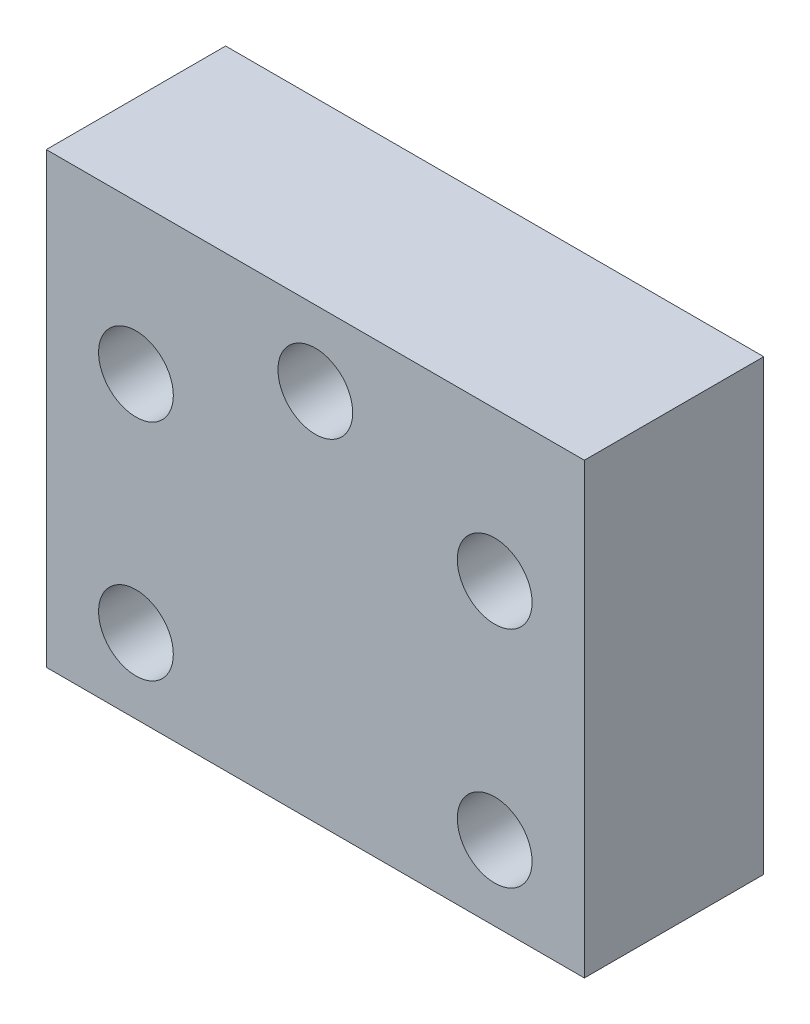
ISO-10303-21;
HEADER;
FILE_DESCRIPTION(('STEP AP214'),'2;1');
FILE_NAME('part.step','',(''),(''),'','','');
FILE_SCHEMA(('AUTOMOTIVE_DESIGN { 1 0 10303 214 1 1 1 1 }'));
ENDSEC;
DATA;
#1=APPLICATION_CONTEXT('core data for automotive mechanical design processes');
#2=APPLICATION_PROTOCOL_DEFINITION('international standard','automotive_design',2000,#1);
#3=PRODUCT_CONTEXT('',#1,'mechanical');
#4=PRODUCT('Part','Part','',(#3));
#5=PRODUCT_RELATED_PRODUCT_CATEGORY('part','',(#4));
#6=PRODUCT_DEFINITION_FORMATION('','',#4);
#7=PRODUCT_DEFINITION_CONTEXT('part definition',#1,'design');
#8=PRODUCT_DEFINITION('design','',#6,#7);
#9=PRODUCT_DEFINITION_SHAPE('','',#8);
#10=(LENGTH_UNIT() NAMED_UNIT(*) SI_UNIT(.MILLI.,.METRE.));
#11=(NAMED_UNIT(*) PLANE_ANGLE_UNIT() SI_UNIT($,.RADIAN.));
#12=(NAMED_UNIT(*) SI_UNIT($,.STERADIAN.) SOLID_ANGLE_UNIT());
#13=UNCERTAINTY_MEASURE_WITH_UNIT(LENGTH_MEASURE(1.E-05),#10,'distance_accuracy_value','');
#14=(GEOMETRIC_REPRESENTATION_CONTEXT(3) GLOBAL_UNCERTAINTY_ASSIGNED_CONTEXT((#13)) GLOBAL_UNIT_ASSIGNED_CONTEXT((#10,
#11,#12)) REPRESENTATION_CONTEXT('',''));
#15=CARTESIAN_POINT('',(0.,0.,0.));
#16=DIRECTION('',(0.,0.,1.));
#17=DIRECTION('',(1.,0.,0.));
#18=AXIS2_PLACEMENT_3D('',#15,#16,#17);
#19=CARTESIAN_POINT('',(-18.,-15.,12.));
#20=DIRECTION('',(1.,0.,0.));
#21=DIRECTION('',(0.,0.,-1.));
#22=AXIS2_PLACEMENT_3D('',#19,#20,#21);
#23=PLANE('',#22);
#24=DIRECTION('',(0.,-1.,0.));
#25=VECTOR('',#24,1.);
#26=CARTESIAN_POINT('',(-18.,-15.,0.));
#27=LINE('',#26,#25);
#28=CARTESIAN_POINT('',(-18.,15.,0.));
#29=VERTEX_POINT('',#28);
#30=CARTESIAN_POINT('',(-18.,-15.,0.));
#31=VERTEX_POINT('',#30);
#32=EDGE_CURVE('E96',#29,#31,#27,.T.);
#33=ORIENTED_EDGE('',*,*,#32,.T.);
#34=DIRECTION('',(0.,0.,-1.));
#35=VECTOR('',#34,1.);
#36=CARTESIAN_POINT('',(-18.,-15.,12.));
#37=LINE('',#36,#35);
#38=CARTESIAN_POINT('',(-18.,-15.,12.));
#39=VERTEX_POINT('',#38);
#40=EDGE_CURVE('E11',#39,#31,#37,.T.);
#41=ORIENTED_EDGE('',*,*,#40,.F.);
#42=DIRECTION('',(0.,-1.,0.));
#43=VECTOR('',#42,1.);
#44=CARTESIAN_POINT('',(-18.,-15.,12.));
#45=LINE('',#44,#43);
#46=CARTESIAN_POINT('',(-18.,15.,12.));
#47=VERTEX_POINT('',#46);
#48=EDGE_CURVE('E84',#47,#39,#45,.T.);
#49=ORIENTED_EDGE('',*,*,#48,.F.);
#50=DIRECTION('',(0.,0.,-1.));
#51=VECTOR('',#50,1.);
#52=CARTESIAN_POINT('',(-18.,15.,12.));
#53=LINE('',#52,#51);
#54=EDGE_CURVE('E92',#47,#29,#53,.T.);
#55=ORIENTED_EDGE('',*,*,#54,.T.);
#56=EDGE_LOOP('',(#33,#41,#49,#55));
#57=FACE_BOUND('',#56,.T.);
#58=ADVANCED_FACE('F33',(#57),#23,.F.);
#59=CARTESIAN_POINT('',(18.,-15.,12.));
#60=DIRECTION('',(0.,1.,0.));
#61=DIRECTION('',(-1.,0.,0.));
#62=AXIS2_PLACEMENT_3D('',#59,#60,#61);
#63=PLANE('',#62);
#64=DIRECTION('',(1.,0.,0.));
#65=VECTOR('',#64,1.);
#66=CARTESIAN_POINT('',(18.,-15.,0.));
#67=LINE('',#66,#65);
#68=CARTESIAN_POINT('',(18.,-15.,0.));
#69=VERTEX_POINT('',#68);
#70=EDGE_CURVE('E88',#31,#69,#67,.T.);
#71=ORIENTED_EDGE('',*,*,#70,.T.);
#72=DIRECTION('',(0.,0.,-1.));
#73=VECTOR('',#72,1.);
#74=CARTESIAN_POINT('',(18.,-15.,12.));
#75=LINE('',#74,#73);
#76=CARTESIAN_POINT('',(18.,-15.,12.));
#77=VERTEX_POINT('',#76);
#78=EDGE_CURVE('E41',#77,#69,#75,.T.);
#79=ORIENTED_EDGE('',*,*,#78,.F.);
#80=DIRECTION('',(1.,0.,0.));
#81=VECTOR('',#80,1.);
#82=CARTESIAN_POINT('',(18.,-15.,12.));
#83=LINE('',#82,#81);
#84=EDGE_CURVE('E79',#39,#77,#83,.T.);
#85=ORIENTED_EDGE('',*,*,#84,.F.);
#86=ORIENTED_EDGE('',*,*,#40,.T.);
#87=EDGE_LOOP('',(#71,#79,#85,#86));
#88=FACE_BOUND('',#87,.T.);
#89=ADVANCED_FACE('F87',(#88),#63,.F.);
#90=CARTESIAN_POINT('',(18.,-15.,12.));
#91=DIRECTION('',(-1.,0.,0.));
#92=DIRECTION('',(0.,0.,1.));
#93=AXIS2_PLACEMENT_3D('',#90,#91,#92);
#94=PLANE('',#93);
#95=DIRECTION('',(0.,1.,0.));
#96=VECTOR('',#95,1.);
#97=CARTESIAN_POINT('',(18.,-15.,0.));
#98=LINE('',#97,#96);
#99=CARTESIAN_POINT('',(18.,15.,0.));
#100=VERTEX_POINT('',#99);
#101=EDGE_CURVE('E66',#69,#100,#98,.T.);
#102=ORIENTED_EDGE('',*,*,#101,.T.);
#103=DIRECTION('',(0.,0.,-1.));
#104=VECTOR('',#103,1.);
#105=CARTESIAN_POINT('',(18.,15.,12.));
#106=LINE('',#105,#104);
#107=CARTESIAN_POINT('',(18.,15.,12.));
#108=VERTEX_POINT('',#107);
#109=EDGE_CURVE('E89',#108,#100,#106,.T.);
#110=ORIENTED_EDGE('',*,*,#109,.F.);
#111=DIRECTION('',(0.,1.,0.));
#112=VECTOR('',#111,1.);
#113=CARTESIAN_POINT('',(18.,-15.,12.));
#114=LINE('',#113,#112);
#115=EDGE_CURVE('E82',#77,#108,#114,.T.);
#116=ORIENTED_EDGE('',*,*,#115,.F.);
#117=ORIENTED_EDGE('',*,*,#78,.T.);
#118=EDGE_LOOP('',(#102,#110,#116,#117));
#119=FACE_BOUND('',#118,.T.);
#120=ADVANCED_FACE('F90',(#119),#94,.F.);
#121=CARTESIAN_POINT('',(18.,15.,12.));
#122=DIRECTION('',(0.,-1.,0.));
#123=DIRECTION('',(1.,0.,0.));
#124=AXIS2_PLACEMENT_3D('',#121,#122,#123);
#125=PLANE('',#124);
#126=DIRECTION('',(-1.,0.,0.));
#127=VECTOR('',#126,1.);
#128=CARTESIAN_POINT('',(18.,15.,0.));
#129=LINE('',#128,#127);
#130=EDGE_CURVE('E72',#100,#29,#129,.T.);
#131=ORIENTED_EDGE('',*,*,#130,.T.);
#132=ORIENTED_EDGE('',*,*,#54,.F.);
#133=DIRECTION('',(-1.,0.,0.));
#134=VECTOR('',#133,1.);
#135=CARTESIAN_POINT('',(18.,15.,12.));
#136=LINE('',#135,#134);
#137=EDGE_CURVE('E49',#108,#47,#136,.T.);
#138=ORIENTED_EDGE('',*,*,#137,.F.);
#139=ORIENTED_EDGE('',*,*,#109,.T.);
#140=EDGE_LOOP('',(#131,#132,#138,#139));
#141=FACE_BOUND('',#140,.T.);
#142=ADVANCED_FACE('F104',(#141),#125,.F.);
#143=CARTESIAN_POINT('',(0.,0.,12.));
#144=DIRECTION('',(0.,0.,1.));
#145=DIRECTION('',(1.,0.,0.));
#146=AXIS2_PLACEMENT_3D('',#143,#144,#145);
#147=PLANE('',#146);
#148=CARTESIAN_POINT('',(0.,10.,12.));
#149=DIRECTION('',(0.,0.,1.));
#150=DIRECTION('',(1.,0.,0.));
#151=AXIS2_PLACEMENT_3D('',#148,#149,#150);
#152=CIRCLE('',#151,2.5);
#153=CARTESIAN_POINT('',(2.5,10.,12.));
#154=VERTEX_POINT('',#153);
#155=EDGE_CURVE('E134',#154,#154,#152,.T.);
#156=ORIENTED_EDGE('',*,*,#155,.F.);
#157=EDGE_LOOP('',(#156));
#158=FACE_BOUND('',#157,.T.);
#159=CARTESIAN_POINT('',(-12.,-10.,12.));
#160=DIRECTION('',(0.,0.,1.));
#161=DIRECTION('',(1.,0.,0.));
#162=AXIS2_PLACEMENT_3D('',#159,#160,#161);
#163=CIRCLE('',#162,2.5);
#164=CARTESIAN_POINT('',(-9.5,-10.,12.));
#165=VERTEX_POINT('',#164);
#166=EDGE_CURVE('E116',#165,#165,#163,.T.);
#167=ORIENTED_EDGE('',*,*,#166,.F.);
#168=EDGE_LOOP('',(#167));
#169=FACE_BOUND('',#168,.T.);
#170=CARTESIAN_POINT('',(12.,-10.,12.));
#171=DIRECTION('',(0.,0.,1.));
#172=DIRECTION('',(1.,0.,0.));
#173=AXIS2_PLACEMENT_3D('',#170,#171,#172);
#174=CIRCLE('',#173,2.5);
#175=CARTESIAN_POINT('',(14.5,-10.,12.));
#176=VERTEX_POINT('',#175);
#177=EDGE_CURVE('E123',#176,#176,#174,.T.);
#178=ORIENTED_EDGE('',*,*,#177,.F.);
#179=EDGE_LOOP('',(#178));
#180=FACE_BOUND('',#179,.T.);
#181=CARTESIAN_POINT('',(12.,5.,12.));
#182=DIRECTION('',(0.,0.,1.));
#183=DIRECTION('',(1.,0.,0.));
#184=AXIS2_PLACEMENT_3D('',#181,#182,#183);
#185=CIRCLE('',#184,2.5);
#186=CARTESIAN_POINT('',(14.5,5.,12.));
#187=VERTEX_POINT('',#186);
#188=EDGE_CURVE('E129',#187,#187,#185,.T.);
#189=ORIENTED_EDGE('',*,*,#188,.F.);
#190=EDGE_LOOP('',(#189));
#191=FACE_BOUND('',#190,.T.);
#192=CARTESIAN_POINT('',(-12.,5.,12.));
#193=DIRECTION('',(0.,0.,1.));
#194=DIRECTION('',(1.,0.,0.));
#195=AXIS2_PLACEMENT_3D('',#192,#193,#194);
#196=CIRCLE('',#195,2.5);
#197=CARTESIAN_POINT('',(-9.5,5.,12.));
#198=VERTEX_POINT('',#197);
#199=EDGE_CURVE('E110',#198,#198,#196,.T.);
#200=ORIENTED_EDGE('',*,*,#199,.F.);
#201=EDGE_LOOP('',(#200));
#202=FACE_BOUND('',#201,.T.);
#203=ORIENTED_EDGE('',*,*,#48,.T.);
#204=ORIENTED_EDGE('',*,*,#84,.T.);
#205=ORIENTED_EDGE('',*,*,#115,.T.);
#206=ORIENTED_EDGE('',*,*,#137,.T.);
#207=EDGE_LOOP('',(#203,#204,#205,#206));
#208=FACE_BOUND('',#207,.T.);
#209=ADVANCED_FACE('F80',(#158,#169,#180,#191,#202,#208),#147,.T.);
#210=CARTESIAN_POINT('',(0.,0.,0.));
#211=DIRECTION('',(0.,0.,1.));
#212=DIRECTION('',(1.,0.,0.));
#213=AXIS2_PLACEMENT_3D('',#210,#211,#212);
#214=PLANE('',#213);
#215=CARTESIAN_POINT('',(0.,10.,0.));
#216=DIRECTION('',(0.,0.,1.));
#217=DIRECTION('',(1.,0.,0.));
#218=AXIS2_PLACEMENT_3D('',#215,#216,#217);
#219=CIRCLE('',#218,2.5);
#220=CARTESIAN_POINT('',(2.5,10.,0.));
#221=VERTEX_POINT('',#220);
#222=EDGE_CURVE('E120',#221,#221,#219,.T.);
#223=ORIENTED_EDGE('',*,*,#222,.T.);
#224=EDGE_LOOP('',(#223));
#225=FACE_BOUND('',#224,.T.);
#226=CARTESIAN_POINT('',(-12.,-10.,0.));
#227=DIRECTION('',(0.,0.,1.));
#228=DIRECTION('',(1.,0.,0.));
#229=AXIS2_PLACEMENT_3D('',#226,#227,#228);
#230=CIRCLE('',#229,2.5);
#231=CARTESIAN_POINT('',(-9.5,-10.,0.));
#232=VERTEX_POINT('',#231);
#233=EDGE_CURVE('E119',#232,#232,#230,.T.);
#234=ORIENTED_EDGE('',*,*,#233,.T.);
#235=EDGE_LOOP('',(#234));
#236=FACE_BOUND('',#235,.T.);
#237=CARTESIAN_POINT('',(12.,-10.,0.));
#238=DIRECTION('',(0.,0.,1.));
#239=DIRECTION('',(1.,0.,0.));
#240=AXIS2_PLACEMENT_3D('',#237,#238,#239);
#241=CIRCLE('',#240,2.5);
#242=CARTESIAN_POINT('',(14.5,-10.,0.));
#243=VERTEX_POINT('',#242);
#244=EDGE_CURVE('E126',#243,#243,#241,.T.);
#245=ORIENTED_EDGE('',*,*,#244,.T.);
#246=EDGE_LOOP('',(#245));
#247=FACE_BOUND('',#246,.T.);
#248=CARTESIAN_POINT('',(12.,5.,0.));
#249=DIRECTION('',(0.,0.,1.));
#250=DIRECTION('',(1.,0.,0.));
#251=AXIS2_PLACEMENT_3D('',#248,#249,#250);
#252=CIRCLE('',#251,2.5);
#253=CARTESIAN_POINT('',(14.5,5.,0.));
#254=VERTEX_POINT('',#253);
#255=EDGE_CURVE('E113',#254,#254,#252,.T.);
#256=ORIENTED_EDGE('',*,*,#255,.T.);
#257=EDGE_LOOP('',(#256));
#258=FACE_BOUND('',#257,.T.);
#259=CARTESIAN_POINT('',(-12.,5.,0.));
#260=DIRECTION('',(0.,0.,1.));
#261=DIRECTION('',(1.,0.,0.));
#262=AXIS2_PLACEMENT_3D('',#259,#260,#261);
#263=CIRCLE('',#262,2.5);
#264=CARTESIAN_POINT('',(-9.5,5.,0.));
#265=VERTEX_POINT('',#264);
#266=EDGE_CURVE('E99',#265,#265,#263,.T.);
#267=ORIENTED_EDGE('',*,*,#266,.T.);
#268=EDGE_LOOP('',(#267));
#269=FACE_BOUND('',#268,.T.);
#270=ORIENTED_EDGE('',*,*,#32,.F.);
#271=ORIENTED_EDGE('',*,*,#130,.F.);
#272=ORIENTED_EDGE('',*,*,#101,.F.);
#273=ORIENTED_EDGE('',*,*,#70,.F.);
#274=EDGE_LOOP('',(#270,#271,#272,#273));
#275=FACE_BOUND('',#274,.T.);
#276=ADVANCED_FACE('F107',(#225,#236,#247,#258,#269,#275),#214,.F.);
#277=CARTESIAN_POINT('',(-12.,5.,0.));
#278=DIRECTION('',(0.,0.,1.));
#279=DIRECTION('',(1.,0.,0.));
#280=AXIS2_PLACEMENT_3D('',#277,#278,#279);
#281=CYLINDRICAL_SURFACE('',#280,2.5);
#282=ORIENTED_EDGE('',*,*,#266,.F.);
#283=EDGE_LOOP('',(#282));
#284=FACE_BOUND('',#283,.T.);
#285=ORIENTED_EDGE('',*,*,#199,.T.);
#286=EDGE_LOOP('',(#285));
#287=FACE_BOUND('',#286,.T.);
#288=ADVANCED_FACE('F160',(#284,#287),#281,.F.);
#289=CARTESIAN_POINT('',(12.,5.,0.));
#290=DIRECTION('',(0.,0.,1.));
#291=DIRECTION('',(1.,0.,0.));
#292=AXIS2_PLACEMENT_3D('',#289,#290,#291);
#293=CYLINDRICAL_SURFACE('',#292,2.5);
#294=ORIENTED_EDGE('',*,*,#255,.F.);
#295=EDGE_LOOP('',(#294));
#296=FACE_BOUND('',#295,.T.);
#297=ORIENTED_EDGE('',*,*,#188,.T.);
#298=EDGE_LOOP('',(#297));
#299=FACE_BOUND('',#298,.T.);
#300=ADVANCED_FACE('F162',(#296,#299),#293,.F.);
#301=CARTESIAN_POINT('',(12.,-10.,0.));
#302=DIRECTION('',(0.,0.,1.));
#303=DIRECTION('',(1.,0.,0.));
#304=AXIS2_PLACEMENT_3D('',#301,#302,#303);
#305=CYLINDRICAL_SURFACE('',#304,2.5);
#306=ORIENTED_EDGE('',*,*,#244,.F.);
#307=EDGE_LOOP('',(#306));
#308=FACE_BOUND('',#307,.T.);
#309=ORIENTED_EDGE('',*,*,#177,.T.);
#310=EDGE_LOOP('',(#309));
#311=FACE_BOUND('',#310,.T.);
#312=ADVANCED_FACE('F169',(#308,#311),#305,.F.);
#313=CARTESIAN_POINT('',(-12.,-10.,0.));
#314=DIRECTION('',(0.,0.,1.));
#315=DIRECTION('',(1.,0.,0.));
#316=AXIS2_PLACEMENT_3D('',#313,#314,#315);
#317=CYLINDRICAL_SURFACE('',#316,2.5);
#318=ORIENTED_EDGE('',*,*,#233,.F.);
#319=EDGE_LOOP('',(#318));
#320=FACE_BOUND('',#319,.T.);
#321=ORIENTED_EDGE('',*,*,#166,.T.);
#322=EDGE_LOOP('',(#321));
#323=FACE_BOUND('',#322,.T.);
#324=ADVANCED_FACE('F145',(#320,#323),#317,.F.);
#325=CARTESIAN_POINT('',(0.,10.,0.));
#326=DIRECTION('',(0.,0.,1.));
#327=DIRECTION('',(1.,0.,0.));
#328=AXIS2_PLACEMENT_3D('',#325,#326,#327);
#329=CYLINDRICAL_SURFACE('',#328,2.5);
#330=ORIENTED_EDGE('',*,*,#222,.F.);
#331=EDGE_LOOP('',(#330));
#332=FACE_BOUND('',#331,.T.);
#333=ORIENTED_EDGE('',*,*,#155,.T.);
#334=EDGE_LOOP('',(#333));
#335=FACE_BOUND('',#334,.T.);
#336=ADVANCED_FACE('F142',(#332,#335),#329,.F.);
#337=CLOSED_SHELL('',(#58,#89,#120,#142,#209,#276,#288,#300,#312,#324,#336));
#338=MANIFOLD_SOLID_BREP('B2',#337);
#339=ADVANCED_BREP_SHAPE_REPRESENTATION('',(#18,#338),#14);
#340=SHAPE_DEFINITION_REPRESENTATION(#9,#339);
ENDSEC;
END-ISO-10303-21;
